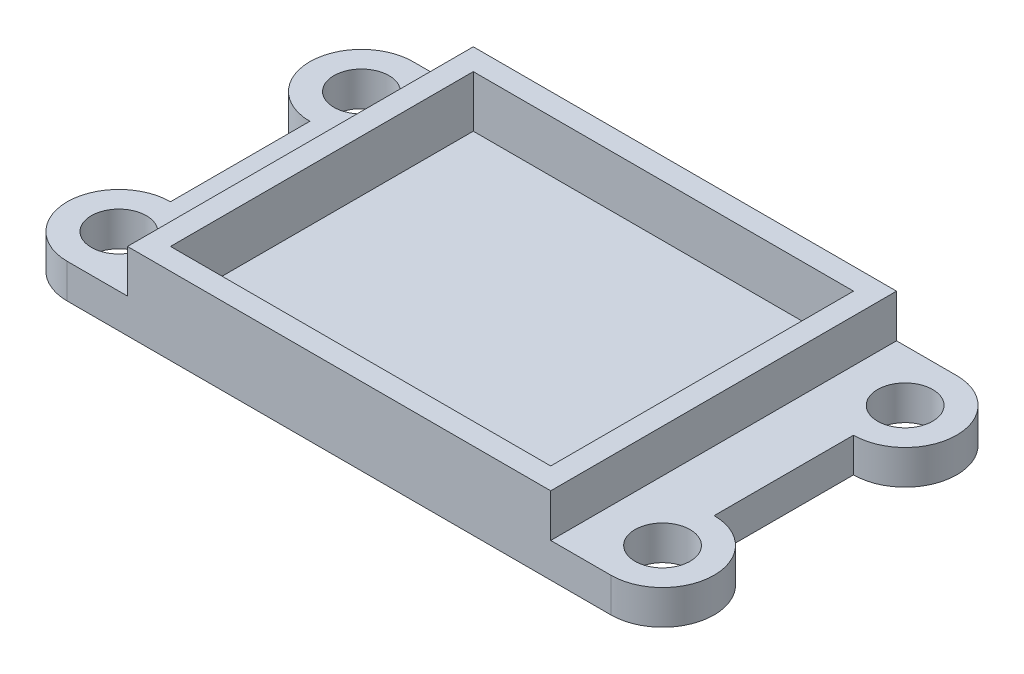
ISO-10303-21;
HEADER;
FILE_DESCRIPTION(('STEP AP214'),'2;1');
FILE_NAME('part.step','',(''),(''),'','','');
FILE_SCHEMA(('AUTOMOTIVE_DESIGN { 1 0 10303 214 1 1 1 1 }'));
ENDSEC;
DATA;
#1=APPLICATION_CONTEXT('core data for automotive mechanical design processes');
#2=APPLICATION_PROTOCOL_DEFINITION('international standard','automotive_design',2000,#1);
#3=PRODUCT_CONTEXT('',#1,'mechanical');
#4=PRODUCT('Part','Part','',(#3));
#5=PRODUCT_RELATED_PRODUCT_CATEGORY('part','',(#4));
#6=PRODUCT_DEFINITION_FORMATION('','',#4);
#7=PRODUCT_DEFINITION_CONTEXT('part definition',#1,'design');
#8=PRODUCT_DEFINITION('design','',#6,#7);
#9=PRODUCT_DEFINITION_SHAPE('','',#8);
#10=(LENGTH_UNIT() NAMED_UNIT(*) SI_UNIT(.MILLI.,.METRE.));
#11=(NAMED_UNIT(*) PLANE_ANGLE_UNIT() SI_UNIT($,.RADIAN.));
#12=(NAMED_UNIT(*) SI_UNIT($,.STERADIAN.) SOLID_ANGLE_UNIT());
#13=UNCERTAINTY_MEASURE_WITH_UNIT(LENGTH_MEASURE(1.E-05),#10,'distance_accuracy_value','');
#14=(GEOMETRIC_REPRESENTATION_CONTEXT(3) GLOBAL_UNCERTAINTY_ASSIGNED_CONTEXT((#13)) GLOBAL_UNIT_ASSIGNED_CONTEXT((#10,
#11,#12)) REPRESENTATION_CONTEXT('',''));
#15=CARTESIAN_POINT('',(0.,0.,0.));
#16=DIRECTION('',(0.,0.,1.));
#17=DIRECTION('',(1.,0.,0.));
#18=AXIS2_PLACEMENT_3D('',#15,#16,#17);
#19=CARTESIAN_POINT('',(12.3,1.5,-10.05));
#20=DIRECTION('',(-1.,0.,0.));
#21=DIRECTION('',(0.,0.,1.));
#22=AXIS2_PLACEMENT_3D('',#19,#20,#21);
#23=PLANE('',#22);
#24=DIRECTION('',(0.,0.,1.));
#25=VECTOR('',#24,1.);
#26=CARTESIAN_POINT('',(12.3,2.,10.05));
#27=LINE('',#26,#25);
#28=CARTESIAN_POINT('',(12.3,2.,-10.05));
#29=VERTEX_POINT('',#28);
#30=CARTESIAN_POINT('',(12.3,2.,10.05));
#31=VERTEX_POINT('',#30);
#32=EDGE_CURVE('E63',#29,#31,#27,.T.);
#33=ORIENTED_EDGE('',*,*,#32,.F.);
#34=DIRECTION('',(0.,-1.,0.));
#35=VECTOR('',#34,1.);
#36=CARTESIAN_POINT('',(12.3,1.5,-10.05));
#37=LINE('',#36,#35);
#38=CARTESIAN_POINT('',(12.3,4.5,-10.05));
#39=VERTEX_POINT('',#38);
#40=EDGE_CURVE('E298',#39,#29,#37,.T.);
#41=ORIENTED_EDGE('',*,*,#40,.F.);
#42=DIRECTION('',(0.,0.,-1.));
#43=VECTOR('',#42,1.);
#44=CARTESIAN_POINT('',(12.3,4.5,-10.05));
#45=LINE('',#44,#43);
#46=CARTESIAN_POINT('',(12.3,4.5,10.05));
#47=VERTEX_POINT('',#46);
#48=EDGE_CURVE('E289',#47,#39,#45,.T.);
#49=ORIENTED_EDGE('',*,*,#48,.F.);
#50=DIRECTION('',(0.,-1.,0.));
#51=VECTOR('',#50,1.);
#52=CARTESIAN_POINT('',(12.3,1.5,10.05));
#53=LINE('',#52,#51);
#54=EDGE_CURVE('E300',#47,#31,#53,.T.);
#55=ORIENTED_EDGE('',*,*,#54,.T.);
#56=EDGE_LOOP('',(#33,#41,#49,#55));
#57=FACE_BOUND('',#56,.T.);
#58=ADVANCED_FACE('F41',(#57),#23,.F.);
#59=CARTESIAN_POINT('',(-12.3,1.5,-10.05));
#60=DIRECTION('',(1.,0.,0.));
#61=DIRECTION('',(0.,0.,-1.));
#62=AXIS2_PLACEMENT_3D('',#59,#60,#61);
#63=PLANE('',#62);
#64=DIRECTION('',(0.,0.,-1.));
#65=VECTOR('',#64,1.);
#66=CARTESIAN_POINT('',(-12.3,2.,-10.05));
#67=LINE('',#66,#65);
#68=CARTESIAN_POINT('',(-12.3,2.,10.05));
#69=VERTEX_POINT('',#68);
#70=CARTESIAN_POINT('',(-12.3,2.,-10.05));
#71=VERTEX_POINT('',#70);
#72=EDGE_CURVE('E55',#69,#71,#67,.T.);
#73=ORIENTED_EDGE('',*,*,#72,.F.);
#74=DIRECTION('',(0.,-1.,0.));
#75=VECTOR('',#74,1.);
#76=CARTESIAN_POINT('',(-12.3,1.5,10.05));
#77=LINE('',#76,#75);
#78=CARTESIAN_POINT('',(-12.3,4.5,10.05));
#79=VERTEX_POINT('',#78);
#80=EDGE_CURVE('E49',#79,#69,#77,.T.);
#81=ORIENTED_EDGE('',*,*,#80,.F.);
#82=DIRECTION('',(0.,0.,1.));
#83=VECTOR('',#82,1.);
#84=CARTESIAN_POINT('',(-12.3,4.5,-10.05));
#85=LINE('',#84,#83);
#86=CARTESIAN_POINT('',(-12.3,4.5,-10.05));
#87=VERTEX_POINT('',#86);
#88=EDGE_CURVE('E283',#87,#79,#85,.T.);
#89=ORIENTED_EDGE('',*,*,#88,.F.);
#90=DIRECTION('',(0.,-1.,0.));
#91=VECTOR('',#90,1.);
#92=CARTESIAN_POINT('',(-12.3,1.5,-10.05));
#93=LINE('',#92,#91);
#94=EDGE_CURVE('E11',#87,#71,#93,.T.);
#95=ORIENTED_EDGE('',*,*,#94,.T.);
#96=EDGE_LOOP('',(#73,#81,#89,#95));
#97=FACE_BOUND('',#96,.T.);
#98=ADVANCED_FACE('F334',(#97),#63,.F.);
#99=CARTESIAN_POINT('',(-12.3,1.5,-10.05));
#100=DIRECTION('',(0.,0.,1.));
#101=DIRECTION('',(1.,0.,0.));
#102=AXIS2_PLACEMENT_3D('',#99,#100,#101);
#103=PLANE('',#102);
#104=DIRECTION('',(-1.,0.,0.));
#105=VECTOR('',#104,1.);
#106=CARTESIAN_POINT('',(-12.3,0.,-10.05));
#107=LINE('',#106,#105);
#108=CARTESIAN_POINT('',(15.8,0.,-10.05));
#109=VERTEX_POINT('',#108);
#110=CARTESIAN_POINT('',(-15.8,0.,-10.05));
#111=VERTEX_POINT('',#110);
#112=EDGE_CURVE('E295',#109,#111,#107,.T.);
#113=ORIENTED_EDGE('',*,*,#112,.T.);
#114=DIRECTION('',(0.,-1.,0.));
#115=VECTOR('',#114,1.);
#116=CARTESIAN_POINT('',(-15.8,2.,-10.05));
#117=LINE('',#116,#115);
#118=CARTESIAN_POINT('',(-15.8,2.,-10.05));
#119=VERTEX_POINT('',#118);
#120=EDGE_CURVE('E196',#119,#111,#117,.T.);
#121=ORIENTED_EDGE('',*,*,#120,.F.);
#122=DIRECTION('',(-1.,0.,0.));
#123=VECTOR('',#122,1.);
#124=CARTESIAN_POINT('',(-15.8,2.,-10.05));
#125=LINE('',#124,#123);
#126=EDGE_CURVE('E200',#71,#119,#125,.T.);
#127=ORIENTED_EDGE('',*,*,#126,.F.);
#128=ORIENTED_EDGE('',*,*,#94,.F.);
#129=DIRECTION('',(-1.,0.,0.));
#130=VECTOR('',#129,1.);
#131=CARTESIAN_POINT('',(-12.3,4.5,-10.05));
#132=LINE('',#131,#130);
#133=EDGE_CURVE('E292',#39,#87,#132,.T.);
#134=ORIENTED_EDGE('',*,*,#133,.F.);
#135=ORIENTED_EDGE('',*,*,#40,.T.);
#136=DIRECTION('',(-1.,0.,0.));
#137=VECTOR('',#136,1.);
#138=CARTESIAN_POINT('',(15.8,2.,-10.05));
#139=LINE('',#138,#137);
#140=CARTESIAN_POINT('',(15.8,2.,-10.05));
#141=VERTEX_POINT('',#140);
#142=EDGE_CURVE('E242',#141,#29,#139,.T.);
#143=ORIENTED_EDGE('',*,*,#142,.F.);
#144=DIRECTION('',(0.,-1.,0.));
#145=VECTOR('',#144,1.);
#146=CARTESIAN_POINT('',(15.8,2.,-10.05));
#147=LINE('',#146,#145);
#148=EDGE_CURVE('E250',#141,#109,#147,.T.);
#149=ORIENTED_EDGE('',*,*,#148,.T.);
#150=EDGE_LOOP('',(#113,#121,#127,#128,#134,#135,#143,#149));
#151=FACE_BOUND('',#150,.T.);
#152=ADVANCED_FACE('F43',(#151),#103,.F.);
#153=CARTESIAN_POINT('',(-12.3,1.5,10.05));
#154=DIRECTION('',(0.,0.,-1.));
#155=DIRECTION('',(-1.,0.,0.));
#156=AXIS2_PLACEMENT_3D('',#153,#154,#155);
#157=PLANE('',#156);
#158=DIRECTION('',(1.,0.,0.));
#159=VECTOR('',#158,1.);
#160=CARTESIAN_POINT('',(-12.3,0.,10.05));
#161=LINE('',#160,#159);
#162=CARTESIAN_POINT('',(-15.8,0.,10.05));
#163=VERTEX_POINT('',#162);
#164=CARTESIAN_POINT('',(15.8,0.,10.05));
#165=VERTEX_POINT('',#164);
#166=EDGE_CURVE('E180',#163,#165,#161,.T.);
#167=ORIENTED_EDGE('',*,*,#166,.T.);
#168=DIRECTION('',(0.,-1.,0.));
#169=VECTOR('',#168,1.);
#170=CARTESIAN_POINT('',(15.8,2.,10.05));
#171=LINE('',#170,#169);
#172=CARTESIAN_POINT('',(15.8,2.,10.05));
#173=VERTEX_POINT('',#172);
#174=EDGE_CURVE('E216',#173,#165,#171,.T.);
#175=ORIENTED_EDGE('',*,*,#174,.F.);
#176=DIRECTION('',(1.,0.,0.));
#177=VECTOR('',#176,1.);
#178=CARTESIAN_POINT('',(15.8,2.,10.05));
#179=LINE('',#178,#177);
#180=EDGE_CURVE('E219',#31,#173,#179,.T.);
#181=ORIENTED_EDGE('',*,*,#180,.F.);
#182=ORIENTED_EDGE('',*,*,#54,.F.);
#183=DIRECTION('',(1.,0.,0.));
#184=VECTOR('',#183,1.);
#185=CARTESIAN_POINT('',(-12.3,4.5,10.05));
#186=LINE('',#185,#184);
#187=EDGE_CURVE('E286',#79,#47,#186,.T.);
#188=ORIENTED_EDGE('',*,*,#187,.F.);
#189=ORIENTED_EDGE('',*,*,#80,.T.);
#190=DIRECTION('',(1.,0.,0.));
#191=VECTOR('',#190,1.);
#192=CARTESIAN_POINT('',(-15.8,2.,10.05));
#193=LINE('',#192,#191);
#194=CARTESIAN_POINT('',(-15.8,2.,10.05));
#195=VERTEX_POINT('',#194);
#196=EDGE_CURVE('E174',#195,#69,#193,.T.);
#197=ORIENTED_EDGE('',*,*,#196,.F.);
#198=DIRECTION('',(0.,-1.,0.));
#199=VECTOR('',#198,1.);
#200=CARTESIAN_POINT('',(-15.8,2.,10.05));
#201=LINE('',#200,#199);
#202=EDGE_CURVE('E163',#195,#163,#201,.T.);
#203=ORIENTED_EDGE('',*,*,#202,.T.);
#204=EDGE_LOOP('',(#167,#175,#181,#182,#188,#189,#197,#203));
#205=FACE_BOUND('',#204,.T.);
#206=ADVANCED_FACE('F303',(#205),#157,.F.);
#207=CARTESIAN_POINT('',(0.,0.,0.));
#208=DIRECTION('',(0.,-1.,0.));
#209=DIRECTION('',(0.,0.,-1.));
#210=AXIS2_PLACEMENT_3D('',#207,#208,#209);
#211=PLANE('',#210);
#212=CARTESIAN_POINT('',(15.8,0.,-7.05));
#213=DIRECTION('',(0.,1.,0.));
#214=DIRECTION('',(0.,0.,1.));
#215=AXIS2_PLACEMENT_3D('',#212,#213,#214);
#216=CIRCLE('',#215,3.);
#217=CARTESIAN_POINT('',(15.8,0.,-4.05));
#218=VERTEX_POINT('',#217);
#219=EDGE_CURVE('E236',#218,#109,#216,.T.);
#220=ORIENTED_EDGE('',*,*,#219,.F.);
#221=DIRECTION('',(0.,0.,-1.));
#222=VECTOR('',#221,1.);
#223=CARTESIAN_POINT('',(15.8,0.,-4.05));
#224=LINE('',#223,#222);
#225=CARTESIAN_POINT('',(15.8,0.,4.04999999999999));
#226=VERTEX_POINT('',#225);
#227=EDGE_CURVE('E310',#226,#218,#224,.T.);
#228=ORIENTED_EDGE('',*,*,#227,.F.);
#229=CARTESIAN_POINT('',(15.8,0.,7.05));
#230=DIRECTION('',(0.,1.,0.));
#231=DIRECTION('',(0.,0.,-1.));
#232=AXIS2_PLACEMENT_3D('',#229,#230,#231);
#233=CIRCLE('',#232,3.);
#234=EDGE_CURVE('E220',#165,#226,#233,.T.);
#235=ORIENTED_EDGE('',*,*,#234,.F.);
#236=ORIENTED_EDGE('',*,*,#166,.F.);
#237=CARTESIAN_POINT('',(-15.8,0.,7.05));
#238=DIRECTION('',(0.,1.,0.));
#239=DIRECTION('',(0.,0.,1.));
#240=AXIS2_PLACEMENT_3D('',#237,#238,#239);
#241=CIRCLE('',#240,3.);
#242=CARTESIAN_POINT('',(-15.8,0.,4.05));
#243=VERTEX_POINT('',#242);
#244=EDGE_CURVE('E171',#243,#163,#241,.T.);
#245=ORIENTED_EDGE('',*,*,#244,.F.);
#246=DIRECTION('',(0.,0.,1.));
#247=VECTOR('',#246,1.);
#248=CARTESIAN_POINT('',(-15.8,0.,-4.05));
#249=LINE('',#248,#247);
#250=CARTESIAN_POINT('',(-15.8,0.,-4.05));
#251=VERTEX_POINT('',#250);
#252=EDGE_CURVE('E152',#251,#243,#249,.T.);
#253=ORIENTED_EDGE('',*,*,#252,.F.);
#254=CARTESIAN_POINT('',(-15.8,0.,-7.05));
#255=DIRECTION('',(0.,1.,0.));
#256=DIRECTION('',(0.,0.,-1.));
#257=AXIS2_PLACEMENT_3D('',#254,#255,#256);
#258=CIRCLE('',#257,3.);
#259=EDGE_CURVE('E201',#111,#251,#258,.T.);
#260=ORIENTED_EDGE('',*,*,#259,.F.);
#261=ORIENTED_EDGE('',*,*,#112,.F.);
#262=EDGE_LOOP('',(#220,#228,#235,#236,#245,#253,#260,#261));
#263=FACE_BOUND('',#262,.T.);
#264=CARTESIAN_POINT('',(15.8,0.,-7.05));
#265=DIRECTION('',(0.,1.,0.));
#266=DIRECTION('',(0.,0.,1.));
#267=AXIS2_PLACEMENT_3D('',#264,#265,#266);
#268=CIRCLE('',#267,1.6);
#269=CARTESIAN_POINT('',(15.8,0.,-5.45));
#270=VERTEX_POINT('',#269);
#271=EDGE_CURVE('E212',#270,#270,#268,.T.);
#272=ORIENTED_EDGE('',*,*,#271,.T.);
#273=EDGE_LOOP('',(#272));
#274=FACE_BOUND('',#273,.T.);
#275=CARTESIAN_POINT('',(15.8,0.,7.05));
#276=DIRECTION('',(0.,1.,0.));
#277=DIRECTION('',(0.,0.,-1.));
#278=AXIS2_PLACEMENT_3D('',#275,#276,#277);
#279=CIRCLE('',#278,1.6);
#280=CARTESIAN_POINT('',(15.8,0.,5.45));
#281=VERTEX_POINT('',#280);
#282=EDGE_CURVE('E197',#281,#281,#279,.T.);
#283=ORIENTED_EDGE('',*,*,#282,.T.);
#284=EDGE_LOOP('',(#283));
#285=FACE_BOUND('',#284,.T.);
#286=CARTESIAN_POINT('',(-15.8,0.,7.05));
#287=DIRECTION('',(0.,1.,0.));
#288=DIRECTION('',(0.,0.,1.));
#289=AXIS2_PLACEMENT_3D('',#286,#287,#288);
#290=CIRCLE('',#289,1.6);
#291=CARTESIAN_POINT('',(-15.8,0.,8.65));
#292=VERTEX_POINT('',#291);
#293=EDGE_CURVE('E185',#292,#292,#290,.T.);
#294=ORIENTED_EDGE('',*,*,#293,.T.);
#295=EDGE_LOOP('',(#294));
#296=FACE_BOUND('',#295,.T.);
#297=CARTESIAN_POINT('',(-15.8,0.,-7.05));
#298=DIRECTION('',(0.,1.,0.));
#299=DIRECTION('',(0.,0.,-1.));
#300=AXIS2_PLACEMENT_3D('',#297,#298,#299);
#301=CIRCLE('',#300,1.6);
#302=CARTESIAN_POINT('',(-15.8,0.,-8.65));
#303=VERTEX_POINT('',#302);
#304=EDGE_CURVE('E209',#303,#303,#301,.T.);
#305=ORIENTED_EDGE('',*,*,#304,.T.);
#306=EDGE_LOOP('',(#305));
#307=FACE_BOUND('',#306,.T.);
#308=ADVANCED_FACE('F177',(#263,#274,#285,#296,#307),#211,.T.);
#309=CARTESIAN_POINT('',(0.,4.5,0.));
#310=DIRECTION('',(0.,1.,0.));
#311=DIRECTION('',(0.,0.,1.));
#312=AXIS2_PLACEMENT_3D('',#309,#310,#311);
#313=PLANE('',#312);
#314=ORIENTED_EDGE('',*,*,#88,.T.);
#315=ORIENTED_EDGE('',*,*,#187,.T.);
#316=ORIENTED_EDGE('',*,*,#48,.T.);
#317=ORIENTED_EDGE('',*,*,#133,.T.);
#318=EDGE_LOOP('',(#314,#315,#316,#317));
#319=FACE_BOUND('',#318,.T.);
#320=DIRECTION('',(0.,0.,1.));
#321=VECTOR('',#320,1.);
#322=CARTESIAN_POINT('',(-11.05,4.5,-8.8));
#323=LINE('',#322,#321);
#324=CARTESIAN_POINT('',(-11.05,4.5,-8.8));
#325=VERTEX_POINT('',#324);
#326=CARTESIAN_POINT('',(-11.05,4.5,8.8));
#327=VERTEX_POINT('',#326);
#328=EDGE_CURVE('E256',#325,#327,#323,.T.);
#329=ORIENTED_EDGE('',*,*,#328,.F.);
#330=DIRECTION('',(-1.,0.,0.));
#331=VECTOR('',#330,1.);
#332=CARTESIAN_POINT('',(-11.05,4.5,-8.8));
#333=LINE('',#332,#331);
#334=CARTESIAN_POINT('',(11.05,4.5,-8.8));
#335=VERTEX_POINT('',#334);
#336=EDGE_CURVE('E254',#335,#325,#333,.T.);
#337=ORIENTED_EDGE('',*,*,#336,.F.);
#338=DIRECTION('',(0.,0.,-1.));
#339=VECTOR('',#338,1.);
#340=CARTESIAN_POINT('',(11.05,4.5,-8.8));
#341=LINE('',#340,#339);
#342=CARTESIAN_POINT('',(11.05,4.5,8.8));
#343=VERTEX_POINT('',#342);
#344=EDGE_CURVE('E262',#343,#335,#341,.T.);
#345=ORIENTED_EDGE('',*,*,#344,.F.);
#346=DIRECTION('',(1.,0.,0.));
#347=VECTOR('',#346,1.);
#348=CARTESIAN_POINT('',(-11.05,4.5,8.8));
#349=LINE('',#348,#347);
#350=EDGE_CURVE('E259',#327,#343,#349,.T.);
#351=ORIENTED_EDGE('',*,*,#350,.F.);
#352=EDGE_LOOP('',(#329,#337,#345,#351));
#353=FACE_BOUND('',#352,.T.);
#354=ADVANCED_FACE('F332',(#319,#353),#313,.T.);
#355=CARTESIAN_POINT('',(-11.05,4.5,-8.8));
#356=DIRECTION('',(0.,0.,1.));
#357=DIRECTION('',(1.,0.,0.));
#358=AXIS2_PLACEMENT_3D('',#355,#356,#357);
#359=PLANE('',#358);
#360=DIRECTION('',(-1.,0.,0.));
#361=VECTOR('',#360,1.);
#362=CARTESIAN_POINT('',(-11.05,1.5,-8.8));
#363=LINE('',#362,#361);
#364=CARTESIAN_POINT('',(11.05,1.5,-8.8));
#365=VERTEX_POINT('',#364);
#366=CARTESIAN_POINT('',(-11.05,1.5,-8.8));
#367=VERTEX_POINT('',#366);
#368=EDGE_CURVE('E253',#365,#367,#363,.T.);
#369=ORIENTED_EDGE('',*,*,#368,.F.);
#370=DIRECTION('',(0.,-1.,0.));
#371=VECTOR('',#370,1.);
#372=CARTESIAN_POINT('',(11.05,4.5,-8.8));
#373=LINE('',#372,#371);
#374=EDGE_CURVE('E264',#335,#365,#373,.T.);
#375=ORIENTED_EDGE('',*,*,#374,.F.);
#376=ORIENTED_EDGE('',*,*,#336,.T.);
#377=DIRECTION('',(0.,-1.,0.));
#378=VECTOR('',#377,1.);
#379=CARTESIAN_POINT('',(-11.05,4.5,-8.8));
#380=LINE('',#379,#378);
#381=EDGE_CURVE('E280',#325,#367,#380,.T.);
#382=ORIENTED_EDGE('',*,*,#381,.T.);
#383=EDGE_LOOP('',(#369,#375,#376,#382));
#384=FACE_BOUND('',#383,.T.);
#385=ADVANCED_FACE('F353',(#384),#359,.T.);
#386=CARTESIAN_POINT('',(-11.05,4.5,-8.8));
#387=DIRECTION('',(1.,0.,0.));
#388=DIRECTION('',(0.,0.,-1.));
#389=AXIS2_PLACEMENT_3D('',#386,#387,#388);
#390=PLANE('',#389);
#391=DIRECTION('',(0.,0.,1.));
#392=VECTOR('',#391,1.);
#393=CARTESIAN_POINT('',(-11.05,1.5,-8.8));
#394=LINE('',#393,#392);
#395=CARTESIAN_POINT('',(-11.05,1.5,8.8));
#396=VERTEX_POINT('',#395);
#397=EDGE_CURVE('E267',#367,#396,#394,.T.);
#398=ORIENTED_EDGE('',*,*,#397,.F.);
#399=ORIENTED_EDGE('',*,*,#381,.F.);
#400=ORIENTED_EDGE('',*,*,#328,.T.);
#401=DIRECTION('',(0.,-1.,0.));
#402=VECTOR('',#401,1.);
#403=CARTESIAN_POINT('',(-11.05,4.5,8.8));
#404=LINE('',#403,#402);
#405=EDGE_CURVE('E278',#327,#396,#404,.T.);
#406=ORIENTED_EDGE('',*,*,#405,.T.);
#407=EDGE_LOOP('',(#398,#399,#400,#406));
#408=FACE_BOUND('',#407,.T.);
#409=ADVANCED_FACE('F356',(#408),#390,.T.);
#410=CARTESIAN_POINT('',(-11.05,4.5,8.8));
#411=DIRECTION('',(0.,0.,-1.));
#412=DIRECTION('',(-1.,0.,0.));
#413=AXIS2_PLACEMENT_3D('',#410,#411,#412);
#414=PLANE('',#413);
#415=DIRECTION('',(1.,0.,0.));
#416=VECTOR('',#415,1.);
#417=CARTESIAN_POINT('',(-11.05,1.5,8.8));
#418=LINE('',#417,#416);
#419=CARTESIAN_POINT('',(11.05,1.5,8.8));
#420=VERTEX_POINT('',#419);
#421=EDGE_CURVE('E270',#396,#420,#418,.T.);
#422=ORIENTED_EDGE('',*,*,#421,.F.);
#423=ORIENTED_EDGE('',*,*,#405,.F.);
#424=ORIENTED_EDGE('',*,*,#350,.T.);
#425=DIRECTION('',(0.,-1.,0.));
#426=VECTOR('',#425,1.);
#427=CARTESIAN_POINT('',(11.05,4.5,8.8));
#428=LINE('',#427,#426);
#429=EDGE_CURVE('E276',#343,#420,#428,.T.);
#430=ORIENTED_EDGE('',*,*,#429,.T.);
#431=EDGE_LOOP('',(#422,#423,#424,#430));
#432=FACE_BOUND('',#431,.T.);
#433=ADVANCED_FACE('F360',(#432),#414,.T.);
#434=CARTESIAN_POINT('',(11.05,4.5,-8.8));
#435=DIRECTION('',(-1.,0.,0.));
#436=DIRECTION('',(0.,0.,1.));
#437=AXIS2_PLACEMENT_3D('',#434,#435,#436);
#438=PLANE('',#437);
#439=DIRECTION('',(0.,0.,-1.));
#440=VECTOR('',#439,1.);
#441=CARTESIAN_POINT('',(11.05,1.5,-8.8));
#442=LINE('',#441,#440);
#443=EDGE_CURVE('E257',#420,#365,#442,.T.);
#444=ORIENTED_EDGE('',*,*,#443,.F.);
#445=ORIENTED_EDGE('',*,*,#429,.F.);
#446=ORIENTED_EDGE('',*,*,#344,.T.);
#447=ORIENTED_EDGE('',*,*,#374,.T.);
#448=EDGE_LOOP('',(#444,#445,#446,#447));
#449=FACE_BOUND('',#448,.T.);
#450=ADVANCED_FACE('F349',(#449),#438,.T.);
#451=CARTESIAN_POINT('',(0.,1.5,0.));
#452=DIRECTION('',(0.,-1.,0.));
#453=DIRECTION('',(0.,0.,-1.));
#454=AXIS2_PLACEMENT_3D('',#451,#452,#453);
#455=PLANE('',#454);
#456=ORIENTED_EDGE('',*,*,#443,.T.);
#457=ORIENTED_EDGE('',*,*,#368,.T.);
#458=ORIENTED_EDGE('',*,*,#397,.T.);
#459=ORIENTED_EDGE('',*,*,#421,.T.);
#460=EDGE_LOOP('',(#456,#457,#458,#459));
#461=FACE_BOUND('',#460,.T.);
#462=ADVANCED_FACE('F346',(#461),#455,.F.);
#463=CARTESIAN_POINT('',(15.8,2.,-7.05));
#464=DIRECTION('',(0.,-1.,0.));
#465=DIRECTION('',(0.,0.,-1.));
#466=AXIS2_PLACEMENT_3D('',#463,#464,#465);
#467=CYLINDRICAL_SURFACE('',#466,3.);
#468=ORIENTED_EDGE('',*,*,#219,.T.);
#469=ORIENTED_EDGE('',*,*,#148,.F.);
#470=CARTESIAN_POINT('',(15.8,2.,-7.05));
#471=DIRECTION('',(0.,1.,0.));
#472=DIRECTION('',(0.,0.,1.));
#473=AXIS2_PLACEMENT_3D('',#470,#471,#472);
#474=CIRCLE('',#473,3.);
#475=CARTESIAN_POINT('',(15.8,2.,-4.05));
#476=VERTEX_POINT('',#475);
#477=EDGE_CURVE('E239',#476,#141,#474,.T.);
#478=ORIENTED_EDGE('',*,*,#477,.F.);
#479=DIRECTION('',(0.,-1.,0.));
#480=VECTOR('',#479,1.);
#481=CARTESIAN_POINT('',(15.8,2.,-4.05));
#482=LINE('',#481,#480);
#483=EDGE_CURVE('E245',#476,#218,#482,.T.);
#484=ORIENTED_EDGE('',*,*,#483,.T.);
#485=EDGE_LOOP('',(#468,#469,#478,#484));
#486=FACE_BOUND('',#485,.T.);
#487=ADVANCED_FACE('F324',(#486),#467,.T.);
#488=CARTESIAN_POINT('',(15.8,2.,-7.05));
#489=DIRECTION('',(0.,-1.,0.));
#490=DIRECTION('',(0.,0.,-1.));
#491=AXIS2_PLACEMENT_3D('',#488,#489,#490);
#492=CYLINDRICAL_SURFACE('',#491,1.6);
#493=CARTESIAN_POINT('',(15.8,2.,-7.05));
#494=DIRECTION('',(0.,1.,0.));
#495=DIRECTION('',(0.,0.,1.));
#496=AXIS2_PLACEMENT_3D('',#493,#494,#495);
#497=CIRCLE('',#496,1.6);
#498=CARTESIAN_POINT('',(15.8,2.,-5.45));
#499=VERTEX_POINT('',#498);
#500=EDGE_CURVE('E233',#499,#499,#497,.T.);
#501=ORIENTED_EDGE('',*,*,#500,.T.);
#502=EDGE_LOOP('',(#501));
#503=FACE_BOUND('',#502,.T.);
#504=ORIENTED_EDGE('',*,*,#271,.F.);
#505=EDGE_LOOP('',(#504));
#506=FACE_BOUND('',#505,.T.);
#507=ADVANCED_FACE('F370',(#503,#506),#492,.F.);
#508=CARTESIAN_POINT('',(15.8,2.,7.05));
#509=DIRECTION('',(0.,-1.,0.));
#510=DIRECTION('',(0.,0.,-1.));
#511=AXIS2_PLACEMENT_3D('',#508,#509,#510);
#512=PLANE('',#511);
#513=CARTESIAN_POINT('',(15.8,2.,7.05));
#514=DIRECTION('',(0.,1.,0.));
#515=DIRECTION('',(0.,0.,-1.));
#516=AXIS2_PLACEMENT_3D('',#513,#514,#515);
#517=CIRCLE('',#516,3.);
#518=CARTESIAN_POINT('',(15.8,2.,4.04999999999999));
#519=VERTEX_POINT('',#518);
#520=EDGE_CURVE('E224',#173,#519,#517,.T.);
#521=ORIENTED_EDGE('',*,*,#520,.T.);
#522=DIRECTION('',(0.,0.,-1.));
#523=VECTOR('',#522,1.);
#524=CARTESIAN_POINT('',(15.8,2.,-4.05));
#525=LINE('',#524,#523);
#526=EDGE_CURVE('E312',#519,#476,#525,.T.);
#527=ORIENTED_EDGE('',*,*,#526,.T.);
#528=ORIENTED_EDGE('',*,*,#477,.T.);
#529=ORIENTED_EDGE('',*,*,#142,.T.);
#530=ORIENTED_EDGE('',*,*,#32,.T.);
#531=ORIENTED_EDGE('',*,*,#180,.T.);
#532=EDGE_LOOP('',(#521,#527,#528,#529,#530,#531));
#533=FACE_BOUND('',#532,.T.);
#534=CARTESIAN_POINT('',(15.8,2.,7.05));
#535=DIRECTION('',(0.,1.,0.));
#536=DIRECTION('',(0.,0.,-1.));
#537=AXIS2_PLACEMENT_3D('',#534,#535,#536);
#538=CIRCLE('',#537,1.6);
#539=CARTESIAN_POINT('',(15.8,2.,5.45));
#540=VERTEX_POINT('',#539);
#541=EDGE_CURVE('E223',#540,#540,#538,.T.);
#542=ORIENTED_EDGE('',*,*,#541,.F.);
#543=EDGE_LOOP('',(#542));
#544=FACE_BOUND('',#543,.T.);
#545=ORIENTED_EDGE('',*,*,#500,.F.);
#546=EDGE_LOOP('',(#545));
#547=FACE_BOUND('',#546,.T.);
#548=ADVANCED_FACE('F317',(#533,#544,#547),#512,.F.);
#549=CARTESIAN_POINT('',(15.8,2.,7.05));
#550=DIRECTION('',(0.,-1.,0.));
#551=DIRECTION('',(0.,0.,-1.));
#552=AXIS2_PLACEMENT_3D('',#549,#550,#551);
#553=CYLINDRICAL_SURFACE('',#552,3.);
#554=ORIENTED_EDGE('',*,*,#234,.T.);
#555=DIRECTION('',(0.,-1.,0.));
#556=VECTOR('',#555,1.);
#557=CARTESIAN_POINT('',(15.8,2.,4.05));
#558=LINE('',#557,#556);
#559=EDGE_CURVE('E193',#519,#226,#558,.T.);
#560=ORIENTED_EDGE('',*,*,#559,.F.);
#561=ORIENTED_EDGE('',*,*,#520,.F.);
#562=ORIENTED_EDGE('',*,*,#174,.T.);
#563=EDGE_LOOP('',(#554,#560,#561,#562));
#564=FACE_BOUND('',#563,.T.);
#565=ADVANCED_FACE('F377',(#564),#553,.T.);
#566=CARTESIAN_POINT('',(15.8,2.,7.05));
#567=DIRECTION('',(0.,-1.,0.));
#568=DIRECTION('',(0.,0.,-1.));
#569=AXIS2_PLACEMENT_3D('',#566,#567,#568);
#570=CYLINDRICAL_SURFACE('',#569,1.6);
#571=ORIENTED_EDGE('',*,*,#541,.T.);
#572=EDGE_LOOP('',(#571));
#573=FACE_BOUND('',#572,.T.);
#574=ORIENTED_EDGE('',*,*,#282,.F.);
#575=EDGE_LOOP('',(#574));
#576=FACE_BOUND('',#575,.T.);
#577=ADVANCED_FACE('F374',(#573,#576),#570,.F.);
#578=CARTESIAN_POINT('',(-15.8,2.,7.05));
#579=DIRECTION('',(0.,-1.,0.));
#580=DIRECTION('',(0.,0.,-1.));
#581=AXIS2_PLACEMENT_3D('',#578,#579,#580);
#582=CYLINDRICAL_SURFACE('',#581,3.);
#583=ORIENTED_EDGE('',*,*,#244,.T.);
#584=ORIENTED_EDGE('',*,*,#202,.F.);
#585=CARTESIAN_POINT('',(-15.8,2.,7.05));
#586=DIRECTION('',(0.,1.,0.));
#587=DIRECTION('',(0.,0.,1.));
#588=AXIS2_PLACEMENT_3D('',#585,#586,#587);
#589=CIRCLE('',#588,3.);
#590=CARTESIAN_POINT('',(-15.8,2.,4.05));
#591=VERTEX_POINT('',#590);
#592=EDGE_CURVE('E173',#591,#195,#589,.T.);
#593=ORIENTED_EDGE('',*,*,#592,.F.);
#594=DIRECTION('',(0.,-1.,0.));
#595=VECTOR('',#594,1.);
#596=CARTESIAN_POINT('',(-15.8,2.,4.05));
#597=LINE('',#596,#595);
#598=EDGE_CURVE('E155',#591,#243,#597,.T.);
#599=ORIENTED_EDGE('',*,*,#598,.T.);
#600=EDGE_LOOP('',(#583,#584,#593,#599));
#601=FACE_BOUND('',#600,.T.);
#602=ADVANCED_FACE('F169',(#601),#582,.T.);
#603=CARTESIAN_POINT('',(-15.8,2.,7.05));
#604=DIRECTION('',(0.,-1.,0.));
#605=DIRECTION('',(0.,0.,-1.));
#606=AXIS2_PLACEMENT_3D('',#603,#604,#605);
#607=CYLINDRICAL_SURFACE('',#606,1.6);
#608=CARTESIAN_POINT('',(-15.8,2.,7.05));
#609=DIRECTION('',(0.,1.,0.));
#610=DIRECTION('',(0.,0.,1.));
#611=AXIS2_PLACEMENT_3D('',#608,#609,#610);
#612=CIRCLE('',#611,1.6);
#613=CARTESIAN_POINT('',(-15.8,2.,8.65));
#614=VERTEX_POINT('',#613);
#615=EDGE_CURVE('E182',#614,#614,#612,.T.);
#616=ORIENTED_EDGE('',*,*,#615,.T.);
#617=EDGE_LOOP('',(#616));
#618=FACE_BOUND('',#617,.T.);
#619=ORIENTED_EDGE('',*,*,#293,.F.);
#620=EDGE_LOOP('',(#619));
#621=FACE_BOUND('',#620,.T.);
#622=ADVANCED_FACE('F391',(#618,#621),#607,.F.);
#623=CARTESIAN_POINT('',(-15.8,2.,-7.05));
#624=DIRECTION('',(0.,-1.,0.));
#625=DIRECTION('',(0.,0.,-1.));
#626=AXIS2_PLACEMENT_3D('',#623,#624,#625);
#627=PLANE('',#626);
#628=CARTESIAN_POINT('',(-15.8,2.,-7.05));
#629=DIRECTION('',(0.,1.,0.));
#630=DIRECTION('',(0.,0.,-1.));
#631=AXIS2_PLACEMENT_3D('',#628,#629,#630);
#632=CIRCLE('',#631,3.);
#633=CARTESIAN_POINT('',(-15.8,2.,-4.05));
#634=VERTEX_POINT('',#633);
#635=EDGE_CURVE('E204',#119,#634,#632,.T.);
#636=ORIENTED_EDGE('',*,*,#635,.T.);
#637=DIRECTION('',(0.,0.,1.));
#638=VECTOR('',#637,1.);
#639=CARTESIAN_POINT('',(-15.8,2.,-4.05));
#640=LINE('',#639,#638);
#641=EDGE_CURVE('E164',#634,#591,#640,.T.);
#642=ORIENTED_EDGE('',*,*,#641,.T.);
#643=ORIENTED_EDGE('',*,*,#592,.T.);
#644=ORIENTED_EDGE('',*,*,#196,.T.);
#645=ORIENTED_EDGE('',*,*,#72,.T.);
#646=ORIENTED_EDGE('',*,*,#126,.T.);
#647=EDGE_LOOP('',(#636,#642,#643,#644,#645,#646));
#648=FACE_BOUND('',#647,.T.);
#649=CARTESIAN_POINT('',(-15.8,2.,-7.05));
#650=DIRECTION('',(0.,1.,0.));
#651=DIRECTION('',(0.,0.,-1.));
#652=AXIS2_PLACEMENT_3D('',#649,#650,#651);
#653=CIRCLE('',#652,1.6);
#654=CARTESIAN_POINT('',(-15.8,2.,-8.65));
#655=VERTEX_POINT('',#654);
#656=EDGE_CURVE('E203',#655,#655,#653,.T.);
#657=ORIENTED_EDGE('',*,*,#656,.F.);
#658=EDGE_LOOP('',(#657));
#659=FACE_BOUND('',#658,.T.);
#660=ORIENTED_EDGE('',*,*,#615,.F.);
#661=EDGE_LOOP('',(#660));
#662=FACE_BOUND('',#661,.T.);
#663=ADVANCED_FACE('F306',(#648,#659,#662),#627,.F.);
#664=CARTESIAN_POINT('',(-15.8,2.,-7.05));
#665=DIRECTION('',(0.,-1.,0.));
#666=DIRECTION('',(0.,0.,-1.));
#667=AXIS2_PLACEMENT_3D('',#664,#665,#666);
#668=CYLINDRICAL_SURFACE('',#667,3.);
#669=ORIENTED_EDGE('',*,*,#259,.T.);
#670=DIRECTION('',(0.,-1.,0.));
#671=VECTOR('',#670,1.);
#672=CARTESIAN_POINT('',(-15.8,2.,-4.05));
#673=LINE('',#672,#671);
#674=EDGE_CURVE('E158',#634,#251,#673,.T.);
#675=ORIENTED_EDGE('',*,*,#674,.F.);
#676=ORIENTED_EDGE('',*,*,#635,.F.);
#677=ORIENTED_EDGE('',*,*,#120,.T.);
#678=EDGE_LOOP('',(#669,#675,#676,#677));
#679=FACE_BOUND('',#678,.T.);
#680=ADVANCED_FACE('F387',(#679),#668,.T.);
#681=CARTESIAN_POINT('',(-15.8,2.,-7.05));
#682=DIRECTION('',(0.,-1.,0.));
#683=DIRECTION('',(0.,0.,-1.));
#684=AXIS2_PLACEMENT_3D('',#681,#682,#683);
#685=CYLINDRICAL_SURFACE('',#684,1.6);
#686=ORIENTED_EDGE('',*,*,#656,.T.);
#687=EDGE_LOOP('',(#686));
#688=FACE_BOUND('',#687,.T.);
#689=ORIENTED_EDGE('',*,*,#304,.F.);
#690=EDGE_LOOP('',(#689));
#691=FACE_BOUND('',#690,.T.);
#692=ADVANCED_FACE('F384',(#688,#691),#685,.F.);
#693=CARTESIAN_POINT('',(-15.8,0.,-4.05));
#694=DIRECTION('',(-1.,0.,0.));
#695=DIRECTION('',(0.,0.,1.));
#696=AXIS2_PLACEMENT_3D('',#693,#694,#695);
#697=PLANE('',#696);
#698=ORIENTED_EDGE('',*,*,#641,.F.);
#699=ORIENTED_EDGE('',*,*,#674,.T.);
#700=ORIENTED_EDGE('',*,*,#252,.T.);
#701=ORIENTED_EDGE('',*,*,#598,.F.);
#702=EDGE_LOOP('',(#698,#699,#700,#701));
#703=FACE_BOUND('',#702,.T.);
#704=ADVANCED_FACE('F154',(#703),#697,.T.);
#705=CARTESIAN_POINT('',(15.8,0.,-4.05));
#706=DIRECTION('',(1.,0.,0.));
#707=DIRECTION('',(0.,0.,-1.));
#708=AXIS2_PLACEMENT_3D('',#705,#706,#707);
#709=PLANE('',#708);
#710=ORIENTED_EDGE('',*,*,#526,.F.);
#711=ORIENTED_EDGE('',*,*,#559,.T.);
#712=ORIENTED_EDGE('',*,*,#227,.T.);
#713=ORIENTED_EDGE('',*,*,#483,.F.);
#714=EDGE_LOOP('',(#710,#711,#712,#713));
#715=FACE_BOUND('',#714,.T.);
#716=ADVANCED_FACE('F400',(#715),#709,.T.);
#717=CLOSED_SHELL('',(#58,#98,#152,#206,#308,#354,#385,#409,#433,#450,#462,#487,#507,#548,#565,
#577,#602,#622,#663,#680,#692,#704,#716));
#718=MANIFOLD_SOLID_BREP('B2',#717);
#719=ADVANCED_BREP_SHAPE_REPRESENTATION('',(#18,#718),#14);
#720=SHAPE_DEFINITION_REPRESENTATION(#9,#719);
ENDSEC;
END-ISO-10303-21;
